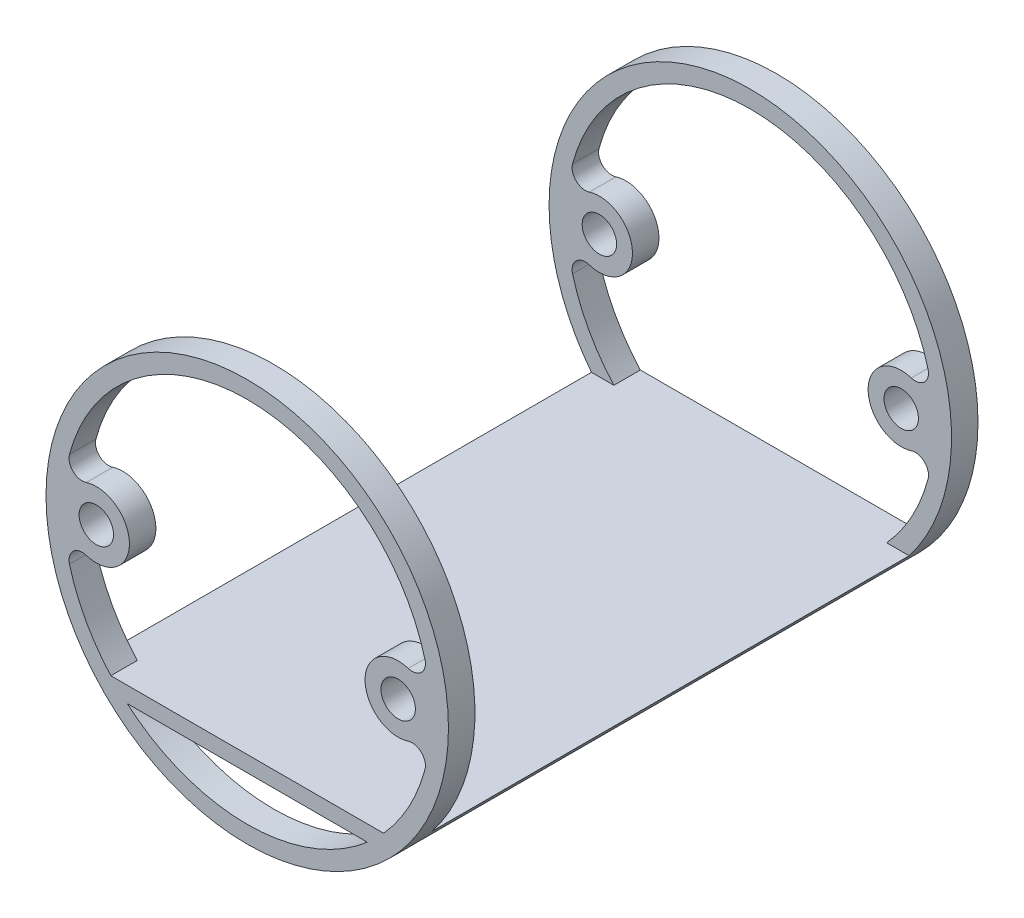
ISO-10303-21;
HEADER;
FILE_DESCRIPTION(('STEP AP214'),'2;1');
FILE_NAME('part.step','',(''),(''),'','','');
FILE_SCHEMA(('AUTOMOTIVE_DESIGN { 1 0 10303 214 1 1 1 1 }'));
ENDSEC;
DATA;
#1=APPLICATION_CONTEXT('core data for automotive mechanical design processes');
#2=APPLICATION_PROTOCOL_DEFINITION('international standard','automotive_design',2000,#1);
#3=PRODUCT_CONTEXT('',#1,'mechanical');
#4=PRODUCT('Part','Part','',(#3));
#5=PRODUCT_RELATED_PRODUCT_CATEGORY('part','',(#4));
#6=PRODUCT_DEFINITION_FORMATION('','',#4);
#7=PRODUCT_DEFINITION_CONTEXT('part definition',#1,'design');
#8=PRODUCT_DEFINITION('design','',#6,#7);
#9=PRODUCT_DEFINITION_SHAPE('','',#8);
#10=(LENGTH_UNIT() NAMED_UNIT(*) SI_UNIT(.MILLI.,.METRE.));
#11=(NAMED_UNIT(*) PLANE_ANGLE_UNIT() SI_UNIT($,.RADIAN.));
#12=(NAMED_UNIT(*) SI_UNIT($,.STERADIAN.) SOLID_ANGLE_UNIT());
#13=UNCERTAINTY_MEASURE_WITH_UNIT(LENGTH_MEASURE(1.E-05),#10,'distance_accuracy_value','');
#14=(GEOMETRIC_REPRESENTATION_CONTEXT(3) GLOBAL_UNCERTAINTY_ASSIGNED_CONTEXT((#13)) GLOBAL_UNIT_ASSIGNED_CONTEXT((#10,
#11,#12)) REPRESENTATION_CONTEXT('',''));
#15=CARTESIAN_POINT('',(0.,0.,0.));
#16=DIRECTION('',(0.,0.,1.));
#17=DIRECTION('',(1.,0.,0.));
#18=AXIS2_PLACEMENT_3D('',#15,#16,#17);
#19=CARTESIAN_POINT('',(0.,0.,0.));
#20=DIRECTION('',(0.,0.,1.));
#21=DIRECTION('',(1.,0.,0.));
#22=AXIS2_PLACEMENT_3D('',#19,#20,#21);
#23=PLANE('',#22);
#24=CARTESIAN_POINT('',(28.5,0.,0.));
#25=DIRECTION('',(0.,0.,1.));
#26=DIRECTION('',(1.,0.,0.));
#27=AXIS2_PLACEMENT_3D('',#24,#25,#26);
#28=CIRCLE('',#27,3.25);
#29=CARTESIAN_POINT('',(31.75,0.,0.));
#30=VERTEX_POINT('',#29);
#31=EDGE_CURVE('E519',#30,#30,#28,.T.);
#32=ORIENTED_EDGE('',*,*,#31,.T.);
#33=EDGE_LOOP('',(#32));
#34=FACE_BOUND('',#33,.T.);
#35=CARTESIAN_POINT('',(-28.5,0.,0.));
#36=DIRECTION('',(0.,0.,1.));
#37=DIRECTION('',(1.,0.,0.));
#38=AXIS2_PLACEMENT_3D('',#35,#36,#37);
#39=CIRCLE('',#38,3.25);
#40=CARTESIAN_POINT('',(-25.25,0.,0.));
#41=VERTEX_POINT('',#40);
#42=EDGE_CURVE('E524',#41,#41,#39,.T.);
#43=ORIENTED_EDGE('',*,*,#42,.T.);
#44=EDGE_LOOP('',(#43));
#45=FACE_BOUND('',#44,.T.);
#46=DIRECTION('',(1.,0.,0.));
#47=VECTOR('',#46,1.);
#48=CARTESIAN_POINT('',(30.,-23.3238075793812,0.));
#49=LINE('',#48,#47);
#50=CARTESIAN_POINT('',(-30.,-23.3238075793812,0.));
#51=VERTEX_POINT('',#50);
#52=CARTESIAN_POINT('',(-25.7597069082705,-23.3238075793812,0.));
#53=VERTEX_POINT('',#52);
#54=EDGE_CURVE('E55',#51,#53,#49,.T.);
#55=ORIENTED_EDGE('',*,*,#54,.F.);
#56=CARTESIAN_POINT('',(0.,0.,0.));
#57=DIRECTION('',(0.,0.,1.));
#58=DIRECTION('',(1.,0.,0.));
#59=AXIS2_PLACEMENT_3D('',#56,#57,#58);
#60=CIRCLE('',#59,38.);
#61=CARTESIAN_POINT('',(30.,-23.3238075793812,0.));
#62=VERTEX_POINT('',#61);
#63=EDGE_CURVE('E47',#62,#51,#60,.T.);
#64=ORIENTED_EDGE('',*,*,#63,.F.);
#65=CARTESIAN_POINT('',(25.7597069082705,-23.3238075793812,0.));
#66=VERTEX_POINT('',#65);
#67=EDGE_CURVE('E11',#66,#62,#49,.T.);
#68=ORIENTED_EDGE('',*,*,#67,.F.);
#69=CARTESIAN_POINT('',(0.,0.,0.));
#70=DIRECTION('',(0.,0.,1.));
#71=DIRECTION('',(1.,0.,0.));
#72=AXIS2_PLACEMENT_3D('',#69,#70,#71);
#73=CIRCLE('',#72,34.75);
#74=CARTESIAN_POINT('',(33.5685094519244,-8.98430148514971,0.));
#75=VERTEX_POINT('',#74);
#76=EDGE_CURVE('E457',#66,#75,#73,.T.);
#77=ORIENTED_EDGE('',*,*,#76,.T.);
#78=CARTESIAN_POINT('',(31.1535087719298,-8.33794886031878,0.));
#79=DIRECTION('',(0.,0.,1.));
#80=DIRECTION('',(1.,0.,0.));
#81=AXIS2_PLACEMENT_3D('',#78,#79,#80);
#82=CIRCLE('',#81,2.5);
#83=CARTESIAN_POINT('',(30.3953634085213,-5.95567775737055,0.));
#84=VERTEX_POINT('',#83);
#85=EDGE_CURVE('E461',#75,#84,#82,.T.);
#86=ORIENTED_EDGE('',*,*,#85,.T.);
#87=CARTESIAN_POINT('',(28.5,0.,0.));
#88=DIRECTION('',(0.,0.,-1.));
#89=DIRECTION('',(1.,0.,0.));
#90=AXIS2_PLACEMENT_3D('',#87,#88,#89);
#91=CIRCLE('',#90,6.25);
#92=CARTESIAN_POINT('',(30.3953634085213,5.95567775737058,0.));
#93=VERTEX_POINT('',#92);
#94=EDGE_CURVE('E465',#84,#93,#91,.T.);
#95=ORIENTED_EDGE('',*,*,#94,.T.);
#96=CARTESIAN_POINT('',(31.1535087719298,8.33794886031881,0.));
#97=DIRECTION('',(0.,0.,1.));
#98=DIRECTION('',(1.,0.,0.));
#99=AXIS2_PLACEMENT_3D('',#96,#97,#98);
#100=CIRCLE('',#99,2.5);
#101=CARTESIAN_POINT('',(33.5685094519244,8.98430148514972,0.));
#102=VERTEX_POINT('',#101);
#103=EDGE_CURVE('E469',#93,#102,#100,.T.);
#104=ORIENTED_EDGE('',*,*,#103,.T.);
#105=CARTESIAN_POINT('',(0.,0.,0.));
#106=DIRECTION('',(0.,0.,1.));
#107=DIRECTION('',(1.,0.,0.));
#108=AXIS2_PLACEMENT_3D('',#105,#106,#107);
#109=CIRCLE('',#108,34.75);
#110=CARTESIAN_POINT('',(-33.5685094519244,8.98430148514971,0.));
#111=VERTEX_POINT('',#110);
#112=EDGE_CURVE('E473',#102,#111,#109,.T.);
#113=ORIENTED_EDGE('',*,*,#112,.T.);
#114=CARTESIAN_POINT('',(-31.1535087719298,8.33794886031879,0.));
#115=DIRECTION('',(0.,0.,1.));
#116=DIRECTION('',(1.,0.,0.));
#117=AXIS2_PLACEMENT_3D('',#114,#115,#116);
#118=CIRCLE('',#117,2.5);
#119=CARTESIAN_POINT('',(-30.3953634085213,5.95567775737057,0.));
#120=VERTEX_POINT('',#119);
#121=EDGE_CURVE('E477',#111,#120,#118,.T.);
#122=ORIENTED_EDGE('',*,*,#121,.T.);
#123=CARTESIAN_POINT('',(-28.5,0.,0.));
#124=DIRECTION('',(0.,0.,-1.));
#125=DIRECTION('',(1.,0.,0.));
#126=AXIS2_PLACEMENT_3D('',#123,#124,#125);
#127=CIRCLE('',#126,6.25);
#128=CARTESIAN_POINT('',(-30.3953634085213,-5.95567775737057,0.));
#129=VERTEX_POINT('',#128);
#130=EDGE_CURVE('E481',#120,#129,#127,.T.);
#131=ORIENTED_EDGE('',*,*,#130,.T.);
#132=CARTESIAN_POINT('',(-31.1535087719298,-8.33794886031879,0.));
#133=DIRECTION('',(0.,0.,1.));
#134=DIRECTION('',(1.,0.,0.));
#135=AXIS2_PLACEMENT_3D('',#132,#133,#134);
#136=CIRCLE('',#135,2.5);
#137=CARTESIAN_POINT('',(-33.5685094519244,-8.98430148514971,0.));
#138=VERTEX_POINT('',#137);
#139=EDGE_CURVE('E425',#129,#138,#136,.T.);
#140=ORIENTED_EDGE('',*,*,#139,.T.);
#141=CARTESIAN_POINT('',(0.,0.,0.));
#142=DIRECTION('',(0.,0.,1.));
#143=DIRECTION('',(1.,0.,0.));
#144=AXIS2_PLACEMENT_3D('',#141,#142,#143);
#145=CIRCLE('',#144,34.75);
#146=EDGE_CURVE('E420',#138,#53,#145,.T.);
#147=ORIENTED_EDGE('',*,*,#146,.T.);
#148=EDGE_LOOP('',(#55,#64,#68,#77,#86,#95,#104,#113,#122,#131,#140,#147));
#149=FACE_BOUND('',#148,.T.);
#150=ADVANCED_FACE('F43',(#34,#45,#149),#23,.F.);
#151=DIRECTION('',(-1.,0.,0.));
#152=VECTOR('',#151,1.);
#153=CARTESIAN_POINT('',(-27.4054219913453,-26.3238075793812,0.));
#154=LINE('',#153,#152);
#155=CARTESIAN_POINT('',(27.4054219913453,-26.3238075793812,0.));
#156=VERTEX_POINT('',#155);
#157=CARTESIAN_POINT('',(22.6852298759284,-26.3238075793812,0.));
#158=VERTEX_POINT('',#157);
#159=EDGE_CURVE('E371',#156,#158,#154,.T.);
#160=ORIENTED_EDGE('',*,*,#159,.F.);
#161=CARTESIAN_POINT('',(-27.4054219913453,-26.3238075793812,0.));
#162=VERTEX_POINT('',#161);
#163=EDGE_CURVE('E537',#162,#156,#60,.T.);
#164=ORIENTED_EDGE('',*,*,#163,.F.);
#165=CARTESIAN_POINT('',(-22.6852298759284,-26.3238075793812,0.));
#166=VERTEX_POINT('',#165);
#167=EDGE_CURVE('E53',#166,#162,#154,.T.);
#168=ORIENTED_EDGE('',*,*,#167,.F.);
#169=CARTESIAN_POINT('',(0.,0.,0.));
#170=DIRECTION('',(0.,0.,1.));
#171=DIRECTION('',(1.,0.,0.));
#172=AXIS2_PLACEMENT_3D('',#169,#170,#171);
#173=CIRCLE('',#172,34.75);
#174=EDGE_CURVE('E403',#166,#158,#173,.T.);
#175=ORIENTED_EDGE('',*,*,#174,.T.);
#176=EDGE_LOOP('',(#160,#164,#168,#175));
#177=FACE_BOUND('',#176,.T.);
#178=ADVANCED_FACE('F569',(#177),#23,.F.);
#179=CARTESIAN_POINT('',(0.,0.,5.));
#180=DIRECTION('',(0.,0.,1.));
#181=DIRECTION('',(1.,0.,0.));
#182=AXIS2_PLACEMENT_3D('',#179,#180,#181);
#183=PLANE('',#182);
#184=CARTESIAN_POINT('',(-28.5,0.,5.));
#185=DIRECTION('',(0.,0.,1.));
#186=DIRECTION('',(1.,0.,0.));
#187=AXIS2_PLACEMENT_3D('',#184,#185,#186);
#188=CIRCLE('',#187,3.25);
#189=CARTESIAN_POINT('',(-25.25,0.,5.));
#190=VERTEX_POINT('',#189);
#191=EDGE_CURVE('E528',#190,#190,#188,.T.);
#192=ORIENTED_EDGE('',*,*,#191,.F.);
#193=EDGE_LOOP('',(#192));
#194=FACE_BOUND('',#193,.T.);
#195=CARTESIAN_POINT('',(0.,0.,5.));
#196=DIRECTION('',(0.,0.,1.));
#197=DIRECTION('',(1.,0.,0.));
#198=AXIS2_PLACEMENT_3D('',#195,#196,#197);
#199=CIRCLE('',#198,38.);
#200=CARTESIAN_POINT('',(38.,0.,5.));
#201=VERTEX_POINT('',#200);
#202=EDGE_CURVE('E534',#201,#201,#199,.T.);
#203=ORIENTED_EDGE('',*,*,#202,.T.);
#204=EDGE_LOOP('',(#203));
#205=FACE_BOUND('',#204,.T.);
#206=CARTESIAN_POINT('',(28.5,0.,5.));
#207=DIRECTION('',(0.,0.,1.));
#208=DIRECTION('',(1.,0.,0.));
#209=AXIS2_PLACEMENT_3D('',#206,#207,#208);
#210=CIRCLE('',#209,3.25);
#211=CARTESIAN_POINT('',(31.75,0.,5.));
#212=VERTEX_POINT('',#211);
#213=EDGE_CURVE('E520',#212,#212,#210,.T.);
#214=ORIENTED_EDGE('',*,*,#213,.F.);
#215=EDGE_LOOP('',(#214));
#216=FACE_BOUND('',#215,.T.);
#217=DIRECTION('',(1.,0.,0.));
#218=VECTOR('',#217,1.);
#219=CARTESIAN_POINT('',(-25.7597069082705,-23.3238075793812,5.));
#220=LINE('',#219,#218);
#221=CARTESIAN_POINT('',(-25.7597069082705,-23.3238075793812,5.));
#222=VERTEX_POINT('',#221);
#223=CARTESIAN_POINT('',(25.7597069082705,-23.3238075793812,5.));
#224=VERTEX_POINT('',#223);
#225=EDGE_CURVE('E424',#222,#224,#220,.T.);
#226=ORIENTED_EDGE('',*,*,#225,.F.);
#227=CARTESIAN_POINT('',(0.,0.,5.));
#228=DIRECTION('',(0.,0.,1.));
#229=DIRECTION('',(1.,0.,0.));
#230=AXIS2_PLACEMENT_3D('',#227,#228,#229);
#231=CIRCLE('',#230,34.75);
#232=CARTESIAN_POINT('',(-33.5685094519244,-8.98430148514971,5.));
#233=VERTEX_POINT('',#232);
#234=EDGE_CURVE('E421',#233,#222,#231,.T.);
#235=ORIENTED_EDGE('',*,*,#234,.F.);
#236=CARTESIAN_POINT('',(-31.1535087719298,-8.33794886031879,5.));
#237=DIRECTION('',(0.,0.,1.));
#238=DIRECTION('',(1.,0.,0.));
#239=AXIS2_PLACEMENT_3D('',#236,#237,#238);
#240=CIRCLE('',#239,2.5);
#241=CARTESIAN_POINT('',(-30.3953634085213,-5.95567775737057,5.));
#242=VERTEX_POINT('',#241);
#243=EDGE_CURVE('E450',#242,#233,#240,.T.);
#244=ORIENTED_EDGE('',*,*,#243,.F.);
#245=CARTESIAN_POINT('',(-28.5,0.,5.));
#246=DIRECTION('',(0.,0.,-1.));
#247=DIRECTION('',(1.,0.,0.));
#248=AXIS2_PLACEMENT_3D('',#245,#246,#247);
#249=CIRCLE('',#248,6.25);
#250=CARTESIAN_POINT('',(-30.3953634085213,5.95567775737057,5.));
#251=VERTEX_POINT('',#250);
#252=EDGE_CURVE('E446',#251,#242,#249,.T.);
#253=ORIENTED_EDGE('',*,*,#252,.F.);
#254=CARTESIAN_POINT('',(-31.1535087719298,8.33794886031879,5.));
#255=DIRECTION('',(0.,0.,1.));
#256=DIRECTION('',(1.,0.,0.));
#257=AXIS2_PLACEMENT_3D('',#254,#255,#256);
#258=CIRCLE('',#257,2.5);
#259=CARTESIAN_POINT('',(-33.5685094519244,8.98430148514971,5.));
#260=VERTEX_POINT('',#259);
#261=EDGE_CURVE('E443',#260,#251,#258,.T.);
#262=ORIENTED_EDGE('',*,*,#261,.F.);
#263=CARTESIAN_POINT('',(0.,0.,5.));
#264=DIRECTION('',(0.,0.,1.));
#265=DIRECTION('',(1.,0.,0.));
#266=AXIS2_PLACEMENT_3D('',#263,#264,#265);
#267=CIRCLE('',#266,34.75);
#268=CARTESIAN_POINT('',(33.5685094519244,8.98430148514972,5.));
#269=VERTEX_POINT('',#268);
#270=EDGE_CURVE('E440',#269,#260,#267,.T.);
#271=ORIENTED_EDGE('',*,*,#270,.F.);
#272=CARTESIAN_POINT('',(31.1535087719298,8.33794886031881,5.));
#273=DIRECTION('',(0.,0.,1.));
#274=DIRECTION('',(1.,0.,0.));
#275=AXIS2_PLACEMENT_3D('',#272,#273,#274);
#276=CIRCLE('',#275,2.5);
#277=CARTESIAN_POINT('',(30.3953634085213,5.95567775737058,5.));
#278=VERTEX_POINT('',#277);
#279=EDGE_CURVE('E437',#278,#269,#276,.T.);
#280=ORIENTED_EDGE('',*,*,#279,.F.);
#281=CARTESIAN_POINT('',(28.5,0.,5.));
#282=DIRECTION('',(0.,0.,-1.));
#283=DIRECTION('',(1.,0.,0.));
#284=AXIS2_PLACEMENT_3D('',#281,#282,#283);
#285=CIRCLE('',#284,6.25);
#286=CARTESIAN_POINT('',(30.3953634085213,-5.95567775737055,5.));
#287=VERTEX_POINT('',#286);
#288=EDGE_CURVE('E434',#287,#278,#285,.T.);
#289=ORIENTED_EDGE('',*,*,#288,.F.);
#290=CARTESIAN_POINT('',(31.1535087719298,-8.33794886031878,5.));
#291=DIRECTION('',(0.,0.,1.));
#292=DIRECTION('',(1.,0.,0.));
#293=AXIS2_PLACEMENT_3D('',#290,#291,#292);
#294=CIRCLE('',#293,2.5);
#295=CARTESIAN_POINT('',(33.5685094519244,-8.98430148514971,5.));
#296=VERTEX_POINT('',#295);
#297=EDGE_CURVE('E431',#296,#287,#294,.T.);
#298=ORIENTED_EDGE('',*,*,#297,.F.);
#299=CARTESIAN_POINT('',(0.,0.,5.));
#300=DIRECTION('',(0.,0.,1.));
#301=DIRECTION('',(1.,0.,0.));
#302=AXIS2_PLACEMENT_3D('',#299,#300,#301);
#303=CIRCLE('',#302,34.75);
#304=EDGE_CURVE('E428',#224,#296,#303,.T.);
#305=ORIENTED_EDGE('',*,*,#304,.F.);
#306=EDGE_LOOP('',(#226,#235,#244,#253,#262,#271,#280,#289,#298,#305));
#307=FACE_BOUND('',#306,.T.);
#308=DIRECTION('',(-1.,0.,0.));
#309=VECTOR('',#308,1.);
#310=CARTESIAN_POINT('',(-22.6852298759284,-26.3238075793812,5.));
#311=LINE('',#310,#309);
#312=CARTESIAN_POINT('',(22.6852298759284,-26.3238075793812,5.));
#313=VERTEX_POINT('',#312);
#314=CARTESIAN_POINT('',(-22.6852298759284,-26.3238075793812,5.));
#315=VERTEX_POINT('',#314);
#316=EDGE_CURVE('E408',#313,#315,#311,.T.);
#317=ORIENTED_EDGE('',*,*,#316,.F.);
#318=CARTESIAN_POINT('',(0.,0.,5.));
#319=DIRECTION('',(0.,0.,1.));
#320=DIRECTION('',(1.,0.,0.));
#321=AXIS2_PLACEMENT_3D('',#318,#319,#320);
#322=CIRCLE('',#321,34.75);
#323=EDGE_CURVE('E404',#315,#313,#322,.T.);
#324=ORIENTED_EDGE('',*,*,#323,.F.);
#325=EDGE_LOOP('',(#317,#324));
#326=FACE_BOUND('',#325,.T.);
#327=ADVANCED_FACE('F575',(#194,#205,#216,#307,#326),#183,.T.);
#328=CARTESIAN_POINT('',(0.,0.,5.));
#329=DIRECTION('',(0.,0.,-1.));
#330=DIRECTION('',(-1.,0.,0.));
#331=AXIS2_PLACEMENT_3D('',#328,#329,#330);
#332=CYLINDRICAL_SURFACE('',#331,38.);
#333=DIRECTION('',(0.,0.,1.));
#334=VECTOR('',#333,1.);
#335=CARTESIAN_POINT('',(27.4054219913453,-26.3238075793812,-90.));
#336=LINE('',#335,#334);
#337=CARTESIAN_POINT('',(27.4054219913453,-26.3238075793812,-90.));
#338=VERTEX_POINT('',#337);
#339=EDGE_CURVE('E399',#338,#156,#336,.T.);
#340=ORIENTED_EDGE('',*,*,#339,.F.);
#341=CARTESIAN_POINT('',(0.,0.,-90.));
#342=DIRECTION('',(0.,0.,-1.));
#343=DIRECTION('',(-1.,0.,0.));
#344=AXIS2_PLACEMENT_3D('',#341,#342,#343);
#345=CIRCLE('',#344,38.);
#346=CARTESIAN_POINT('',(-27.4054219913453,-26.3238075793812,-90.));
#347=VERTEX_POINT('',#346);
#348=EDGE_CURVE('E372',#338,#347,#345,.T.);
#349=ORIENTED_EDGE('',*,*,#348,.T.);
#350=DIRECTION('',(0.,0.,1.));
#351=VECTOR('',#350,1.);
#352=CARTESIAN_POINT('',(-27.4054219913453,-26.3238075793812,-90.));
#353=LINE('',#352,#351);
#354=EDGE_CURVE('E395',#347,#162,#353,.T.);
#355=ORIENTED_EDGE('',*,*,#354,.T.);
#356=ORIENTED_EDGE('',*,*,#163,.T.);
#357=EDGE_LOOP('',(#340,#349,#355,#356));
#358=FACE_BOUND('',#357,.T.);
#359=ORIENTED_EDGE('',*,*,#202,.F.);
#360=EDGE_LOOP('',(#359));
#361=FACE_BOUND('',#360,.T.);
#362=ORIENTED_EDGE('',*,*,#63,.T.);
#363=DIRECTION('',(0.,0.,1.));
#364=VECTOR('',#363,1.);
#365=CARTESIAN_POINT('',(-30.,-23.3238075793812,-90.));
#366=LINE('',#365,#364);
#367=CARTESIAN_POINT('',(-30.,-23.3238075793812,-90.));
#368=VERTEX_POINT('',#367);
#369=EDGE_CURVE('E391',#368,#51,#366,.T.);
#370=ORIENTED_EDGE('',*,*,#369,.F.);
#371=CARTESIAN_POINT('',(30.,-23.3238075793812,-90.));
#372=VERTEX_POINT('',#371);
#373=EDGE_CURVE('E366',#368,#372,#345,.T.);
#374=ORIENTED_EDGE('',*,*,#373,.T.);
#375=DIRECTION('',(0.,0.,1.));
#376=VECTOR('',#375,1.);
#377=CARTESIAN_POINT('',(30.,-23.3238075793812,-90.));
#378=LINE('',#377,#376);
#379=EDGE_CURVE('E382',#372,#62,#378,.T.);
#380=ORIENTED_EDGE('',*,*,#379,.T.);
#381=EDGE_LOOP('',(#362,#370,#374,#380));
#382=FACE_BOUND('',#381,.T.);
#383=CARTESIAN_POINT('',(0.,0.,-95.));
#384=DIRECTION('',(0.,0.,-1.));
#385=DIRECTION('',(-1.,0.,0.));
#386=AXIS2_PLACEMENT_3D('',#383,#384,#385);
#387=CIRCLE('',#386,38.);
#388=CARTESIAN_POINT('',(-38.,0.,-95.));
#389=VERTEX_POINT('',#388);
#390=EDGE_CURVE('E367',#389,#389,#387,.T.);
#391=ORIENTED_EDGE('',*,*,#390,.F.);
#392=EDGE_LOOP('',(#391));
#393=FACE_BOUND('',#392,.T.);
#394=ADVANCED_FACE('F45',(#358,#361,#382,#393),#332,.T.);
#395=CARTESIAN_POINT('',(-28.5,0.,5.));
#396=DIRECTION('',(0.,0.,-1.));
#397=DIRECTION('',(-1.,0.,0.));
#398=AXIS2_PLACEMENT_3D('',#395,#396,#397);
#399=CYLINDRICAL_SURFACE('',#398,3.25);
#400=ORIENTED_EDGE('',*,*,#191,.T.);
#401=EDGE_LOOP('',(#400));
#402=FACE_BOUND('',#401,.T.);
#403=ORIENTED_EDGE('',*,*,#42,.F.);
#404=EDGE_LOOP('',(#403));
#405=FACE_BOUND('',#404,.T.);
#406=ADVANCED_FACE('F583',(#402,#405),#399,.F.);
#407=CARTESIAN_POINT('',(28.5,0.,5.));
#408=DIRECTION('',(0.,0.,-1.));
#409=DIRECTION('',(-1.,0.,0.));
#410=AXIS2_PLACEMENT_3D('',#407,#408,#409);
#411=CYLINDRICAL_SURFACE('',#410,3.25);
#412=ORIENTED_EDGE('',*,*,#213,.T.);
#413=EDGE_LOOP('',(#412));
#414=FACE_BOUND('',#413,.T.);
#415=ORIENTED_EDGE('',*,*,#31,.F.);
#416=EDGE_LOOP('',(#415));
#417=FACE_BOUND('',#416,.T.);
#418=ADVANCED_FACE('F662',(#414,#417),#411,.F.);
#419=CARTESIAN_POINT('',(0.,0.,5.));
#420=DIRECTION('',(0.,0.,-1.));
#421=DIRECTION('',(-1.,0.,0.));
#422=AXIS2_PLACEMENT_3D('',#419,#420,#421);
#423=CYLINDRICAL_SURFACE('',#422,34.75);
#424=ORIENTED_EDGE('',*,*,#146,.F.);
#425=DIRECTION('',(0.,0.,-1.));
#426=VECTOR('',#425,1.);
#427=CARTESIAN_POINT('',(-33.5685094519244,-8.98430148514971,5.));
#428=LINE('',#427,#426);
#429=EDGE_CURVE('E453',#233,#138,#428,.T.);
#430=ORIENTED_EDGE('',*,*,#429,.F.);
#431=ORIENTED_EDGE('',*,*,#234,.T.);
#432=DIRECTION('',(0.,0.,-1.));
#433=VECTOR('',#432,1.);
#434=CARTESIAN_POINT('',(-25.7597069082705,-23.3238075793812,5.));
#435=LINE('',#434,#433);
#436=EDGE_CURVE('E516',#222,#53,#435,.T.);
#437=ORIENTED_EDGE('',*,*,#436,.T.);
#438=EDGE_LOOP('',(#424,#430,#431,#437));
#439=FACE_BOUND('',#438,.T.);
#440=ADVANCED_FACE('F596',(#439),#423,.F.);
#441=CARTESIAN_POINT('',(-25.7597069082705,-23.3238075793812,5.));
#442=DIRECTION('',(0.,1.,0.));
#443=DIRECTION('',(0.,0.,1.));
#444=AXIS2_PLACEMENT_3D('',#441,#442,#443);
#445=PLANE('',#444);
#446=DIRECTION('',(0.,0.,-1.));
#447=VECTOR('',#446,1.);
#448=CARTESIAN_POINT('',(25.7597069082705,-23.3238075793812,5.));
#449=LINE('',#448,#447);
#450=EDGE_CURVE('E512',#224,#66,#449,.T.);
#451=ORIENTED_EDGE('',*,*,#450,.T.);
#452=ORIENTED_EDGE('',*,*,#67,.T.);
#453=ORIENTED_EDGE('',*,*,#379,.F.);
#454=DIRECTION('',(1.,0.,0.));
#455=VECTOR('',#454,1.);
#456=CARTESIAN_POINT('',(30.,-23.3238075793812,-90.));
#457=LINE('',#456,#455);
#458=CARTESIAN_POINT('',(25.7597069082705,-23.3238075793812,-90.));
#459=VERTEX_POINT('',#458);
#460=EDGE_CURVE('E62',#459,#372,#457,.T.);
#461=ORIENTED_EDGE('',*,*,#460,.F.);
#462=DIRECTION('',(0.,0.,1.));
#463=VECTOR('',#462,1.);
#464=CARTESIAN_POINT('',(25.7597069082705,-23.3238075793812,-95.));
#465=LINE('',#464,#463);
#466=CARTESIAN_POINT('',(25.7597069082705,-23.3238075793812,-95.));
#467=VERTEX_POINT('',#466);
#468=EDGE_CURVE('E359',#467,#459,#465,.T.);
#469=ORIENTED_EDGE('',*,*,#468,.F.);
#470=DIRECTION('',(-1.,0.,0.));
#471=VECTOR('',#470,1.);
#472=CARTESIAN_POINT('',(-25.7597069082705,-23.3238075793812,-95.));
#473=LINE('',#472,#471);
#474=CARTESIAN_POINT('',(-25.7597069082705,-23.3238075793812,-95.));
#475=VERTEX_POINT('',#474);
#476=EDGE_CURVE('E276',#467,#475,#473,.T.);
#477=ORIENTED_EDGE('',*,*,#476,.T.);
#478=DIRECTION('',(0.,0.,1.));
#479=VECTOR('',#478,1.);
#480=CARTESIAN_POINT('',(-25.7597069082705,-23.3238075793812,-95.));
#481=LINE('',#480,#479);
#482=CARTESIAN_POINT('',(-25.7597069082705,-23.3238075793812,-90.));
#483=VERTEX_POINT('',#482);
#484=EDGE_CURVE('E356',#475,#483,#481,.T.);
#485=ORIENTED_EDGE('',*,*,#484,.T.);
#486=EDGE_CURVE('E70',#368,#483,#457,.T.);
#487=ORIENTED_EDGE('',*,*,#486,.F.);
#488=ORIENTED_EDGE('',*,*,#369,.T.);
#489=ORIENTED_EDGE('',*,*,#54,.T.);
#490=ORIENTED_EDGE('',*,*,#436,.F.);
#491=ORIENTED_EDGE('',*,*,#225,.T.);
#492=EDGE_LOOP('',(#451,#452,#453,#461,#469,#477,#485,#487,#488,#489,#490,#491));
#493=FACE_BOUND('',#492,.T.);
#494=ADVANCED_FACE('F551',(#493),#445,.T.);
#495=CARTESIAN_POINT('',(0.,0.,5.));
#496=DIRECTION('',(0.,0.,-1.));
#497=DIRECTION('',(-1.,0.,0.));
#498=AXIS2_PLACEMENT_3D('',#495,#496,#497);
#499=CYLINDRICAL_SURFACE('',#498,34.75);
#500=ORIENTED_EDGE('',*,*,#76,.F.);
#501=ORIENTED_EDGE('',*,*,#450,.F.);
#502=ORIENTED_EDGE('',*,*,#304,.T.);
#503=DIRECTION('',(0.,0.,-1.));
#504=VECTOR('',#503,1.);
#505=CARTESIAN_POINT('',(33.5685094519244,-8.98430148514971,5.));
#506=LINE('',#505,#504);
#507=EDGE_CURVE('E509',#296,#75,#506,.T.);
#508=ORIENTED_EDGE('',*,*,#507,.T.);
#509=EDGE_LOOP('',(#500,#501,#502,#508));
#510=FACE_BOUND('',#509,.T.);
#511=ADVANCED_FACE('F609',(#510),#499,.F.);
#512=CARTESIAN_POINT('',(31.1535087719298,-8.33794886031878,5.));
#513=DIRECTION('',(0.,0.,-1.));
#514=DIRECTION('',(-1.,0.,0.));
#515=AXIS2_PLACEMENT_3D('',#512,#513,#514);
#516=CYLINDRICAL_SURFACE('',#515,2.5);
#517=ORIENTED_EDGE('',*,*,#85,.F.);
#518=ORIENTED_EDGE('',*,*,#507,.F.);
#519=ORIENTED_EDGE('',*,*,#297,.T.);
#520=DIRECTION('',(0.,0.,-1.));
#521=VECTOR('',#520,1.);
#522=CARTESIAN_POINT('',(30.3953634085213,-5.95567775737055,5.));
#523=LINE('',#522,#521);
#524=EDGE_CURVE('E506',#287,#84,#523,.T.);
#525=ORIENTED_EDGE('',*,*,#524,.T.);
#526=EDGE_LOOP('',(#517,#518,#519,#525));
#527=FACE_BOUND('',#526,.T.);
#528=ADVANCED_FACE('F617',(#527),#516,.F.);
#529=CARTESIAN_POINT('',(28.5,0.,5.));
#530=DIRECTION('',(0.,0.,-1.));
#531=DIRECTION('',(-1.,0.,0.));
#532=AXIS2_PLACEMENT_3D('',#529,#530,#531);
#533=CYLINDRICAL_SURFACE('',#532,6.25);
#534=ORIENTED_EDGE('',*,*,#94,.F.);
#535=ORIENTED_EDGE('',*,*,#524,.F.);
#536=ORIENTED_EDGE('',*,*,#288,.T.);
#537=DIRECTION('',(0.,0.,-1.));
#538=VECTOR('',#537,1.);
#539=CARTESIAN_POINT('',(30.3953634085213,5.95567775737058,5.));
#540=LINE('',#539,#538);
#541=EDGE_CURVE('E503',#278,#93,#540,.T.);
#542=ORIENTED_EDGE('',*,*,#541,.T.);
#543=EDGE_LOOP('',(#534,#535,#536,#542));
#544=FACE_BOUND('',#543,.T.);
#545=ADVANCED_FACE('F620',(#544),#533,.T.);
#546=CARTESIAN_POINT('',(31.1535087719298,8.33794886031881,5.));
#547=DIRECTION('',(0.,0.,-1.));
#548=DIRECTION('',(-1.,0.,0.));
#549=AXIS2_PLACEMENT_3D('',#546,#547,#548);
#550=CYLINDRICAL_SURFACE('',#549,2.5);
#551=ORIENTED_EDGE('',*,*,#103,.F.);
#552=ORIENTED_EDGE('',*,*,#541,.F.);
#553=ORIENTED_EDGE('',*,*,#279,.T.);
#554=DIRECTION('',(0.,0.,-1.));
#555=VECTOR('',#554,1.);
#556=CARTESIAN_POINT('',(33.5685094519244,8.98430148514972,5.));
#557=LINE('',#556,#555);
#558=EDGE_CURVE('E500',#269,#102,#557,.T.);
#559=ORIENTED_EDGE('',*,*,#558,.T.);
#560=EDGE_LOOP('',(#551,#552,#553,#559));
#561=FACE_BOUND('',#560,.T.);
#562=ADVANCED_FACE('F625',(#561),#550,.F.);
#563=CARTESIAN_POINT('',(0.,0.,5.));
#564=DIRECTION('',(0.,0.,-1.));
#565=DIRECTION('',(-1.,0.,0.));
#566=AXIS2_PLACEMENT_3D('',#563,#564,#565);
#567=CYLINDRICAL_SURFACE('',#566,34.75);
#568=ORIENTED_EDGE('',*,*,#112,.F.);
#569=ORIENTED_EDGE('',*,*,#558,.F.);
#570=ORIENTED_EDGE('',*,*,#270,.T.);
#571=DIRECTION('',(0.,0.,-1.));
#572=VECTOR('',#571,1.);
#573=CARTESIAN_POINT('',(-33.5685094519244,8.98430148514971,5.));
#574=LINE('',#573,#572);
#575=EDGE_CURVE('E497',#260,#111,#574,.T.);
#576=ORIENTED_EDGE('',*,*,#575,.T.);
#577=EDGE_LOOP('',(#568,#569,#570,#576));
#578=FACE_BOUND('',#577,.T.);
#579=ADVANCED_FACE('F629',(#578),#567,.F.);
#580=CARTESIAN_POINT('',(-31.1535087719298,8.33794886031879,5.));
#581=DIRECTION('',(0.,0.,-1.));
#582=DIRECTION('',(-1.,0.,0.));
#583=AXIS2_PLACEMENT_3D('',#580,#581,#582);
#584=CYLINDRICAL_SURFACE('',#583,2.5);
#585=ORIENTED_EDGE('',*,*,#121,.F.);
#586=ORIENTED_EDGE('',*,*,#575,.F.);
#587=ORIENTED_EDGE('',*,*,#261,.T.);
#588=DIRECTION('',(0.,0.,-1.));
#589=VECTOR('',#588,1.);
#590=CARTESIAN_POINT('',(-30.3953634085213,5.95567775737057,5.));
#591=LINE('',#590,#589);
#592=EDGE_CURVE('E494',#251,#120,#591,.T.);
#593=ORIENTED_EDGE('',*,*,#592,.T.);
#594=EDGE_LOOP('',(#585,#586,#587,#593));
#595=FACE_BOUND('',#594,.T.);
#596=ADVANCED_FACE('F633',(#595),#584,.F.);
#597=CARTESIAN_POINT('',(-28.5,0.,5.));
#598=DIRECTION('',(0.,0.,-1.));
#599=DIRECTION('',(-1.,0.,0.));
#600=AXIS2_PLACEMENT_3D('',#597,#598,#599);
#601=CYLINDRICAL_SURFACE('',#600,6.25);
#602=ORIENTED_EDGE('',*,*,#130,.F.);
#603=ORIENTED_EDGE('',*,*,#592,.F.);
#604=ORIENTED_EDGE('',*,*,#252,.T.);
#605=DIRECTION('',(0.,0.,-1.));
#606=VECTOR('',#605,1.);
#607=CARTESIAN_POINT('',(-30.3953634085213,-5.95567775737057,5.));
#608=LINE('',#607,#606);
#609=EDGE_CURVE('E491',#242,#129,#608,.T.);
#610=ORIENTED_EDGE('',*,*,#609,.T.);
#611=EDGE_LOOP('',(#602,#603,#604,#610));
#612=FACE_BOUND('',#611,.T.);
#613=ADVANCED_FACE('F637',(#612),#601,.T.);
#614=CARTESIAN_POINT('',(-31.1535087719298,-8.33794886031879,5.));
#615=DIRECTION('',(0.,0.,-1.));
#616=DIRECTION('',(-1.,0.,0.));
#617=AXIS2_PLACEMENT_3D('',#614,#615,#616);
#618=CYLINDRICAL_SURFACE('',#617,2.5);
#619=ORIENTED_EDGE('',*,*,#139,.F.);
#620=ORIENTED_EDGE('',*,*,#609,.F.);
#621=ORIENTED_EDGE('',*,*,#243,.T.);
#622=ORIENTED_EDGE('',*,*,#429,.T.);
#623=EDGE_LOOP('',(#619,#620,#621,#622));
#624=FACE_BOUND('',#623,.T.);
#625=ADVANCED_FACE('F599',(#624),#618,.F.);
#626=CARTESIAN_POINT('',(0.,0.,5.));
#627=DIRECTION('',(0.,0.,-1.));
#628=DIRECTION('',(-1.,0.,0.));
#629=AXIS2_PLACEMENT_3D('',#626,#627,#628);
#630=CYLINDRICAL_SURFACE('',#629,34.75);
#631=ORIENTED_EDGE('',*,*,#174,.F.);
#632=DIRECTION('',(0.,0.,-1.));
#633=VECTOR('',#632,1.);
#634=CARTESIAN_POINT('',(-22.6852298759284,-26.3238075793812,5.));
#635=LINE('',#634,#633);
#636=EDGE_CURVE('E411',#315,#166,#635,.T.);
#637=ORIENTED_EDGE('',*,*,#636,.F.);
#638=ORIENTED_EDGE('',*,*,#323,.T.);
#639=DIRECTION('',(0.,0.,-1.));
#640=VECTOR('',#639,1.);
#641=CARTESIAN_POINT('',(22.6852298759284,-26.3238075793812,5.));
#642=LINE('',#641,#640);
#643=EDGE_CURVE('E417',#313,#158,#642,.T.);
#644=ORIENTED_EDGE('',*,*,#643,.T.);
#645=EDGE_LOOP('',(#631,#637,#638,#644));
#646=FACE_BOUND('',#645,.T.);
#647=ADVANCED_FACE('F571',(#646),#630,.F.);
#648=CARTESIAN_POINT('',(-22.6852298759284,-26.3238075793812,5.));
#649=DIRECTION('',(0.,-1.,0.));
#650=DIRECTION('',(0.,0.,-1.));
#651=AXIS2_PLACEMENT_3D('',#648,#649,#650);
#652=PLANE('',#651);
#653=ORIENTED_EDGE('',*,*,#636,.T.);
#654=ORIENTED_EDGE('',*,*,#167,.T.);
#655=ORIENTED_EDGE('',*,*,#354,.F.);
#656=DIRECTION('',(-1.,0.,0.));
#657=VECTOR('',#656,1.);
#658=CARTESIAN_POINT('',(-27.4054219913453,-26.3238075793812,-90.));
#659=LINE('',#658,#657);
#660=CARTESIAN_POINT('',(-22.6852298759284,-26.3238075793812,-90.));
#661=VERTEX_POINT('',#660);
#662=EDGE_CURVE('E379',#661,#347,#659,.T.);
#663=ORIENTED_EDGE('',*,*,#662,.F.);
#664=DIRECTION('',(0.,0.,1.));
#665=VECTOR('',#664,1.);
#666=CARTESIAN_POINT('',(-22.6852298759284,-26.3238075793812,-95.));
#667=LINE('',#666,#665);
#668=CARTESIAN_POINT('',(-22.6852298759284,-26.3238075793812,-95.));
#669=VERTEX_POINT('',#668);
#670=EDGE_CURVE('E241',#669,#661,#667,.T.);
#671=ORIENTED_EDGE('',*,*,#670,.F.);
#672=DIRECTION('',(1.,0.,0.));
#673=VECTOR('',#672,1.);
#674=CARTESIAN_POINT('',(22.6852298759284,-26.3238075793812,-95.));
#675=LINE('',#674,#673);
#676=CARTESIAN_POINT('',(22.6852298759284,-26.3238075793812,-95.));
#677=VERTEX_POINT('',#676);
#678=EDGE_CURVE('E235',#669,#677,#675,.T.);
#679=ORIENTED_EDGE('',*,*,#678,.T.);
#680=DIRECTION('',(0.,0.,1.));
#681=VECTOR('',#680,1.);
#682=CARTESIAN_POINT('',(22.6852298759284,-26.3238075793812,-95.));
#683=LINE('',#682,#681);
#684=CARTESIAN_POINT('',(22.6852298759284,-26.3238075793812,-90.));
#685=VERTEX_POINT('',#684);
#686=EDGE_CURVE('E239',#677,#685,#683,.T.);
#687=ORIENTED_EDGE('',*,*,#686,.T.);
#688=EDGE_CURVE('E376',#338,#685,#659,.T.);
#689=ORIENTED_EDGE('',*,*,#688,.F.);
#690=ORIENTED_EDGE('',*,*,#339,.T.);
#691=ORIENTED_EDGE('',*,*,#159,.T.);
#692=ORIENTED_EDGE('',*,*,#643,.F.);
#693=ORIENTED_EDGE('',*,*,#316,.T.);
#694=EDGE_LOOP('',(#653,#654,#655,#663,#671,#679,#687,#689,#690,#691,#692,#693));
#695=FACE_BOUND('',#694,.T.);
#696=ADVANCED_FACE('F238',(#695),#652,.T.);
#697=CARTESIAN_POINT('',(0.,0.,-90.));
#698=DIRECTION('',(0.,0.,-1.));
#699=DIRECTION('',(-1.,0.,0.));
#700=AXIS2_PLACEMENT_3D('',#697,#698,#699);
#701=PLANE('',#700);
#702=ORIENTED_EDGE('',*,*,#348,.F.);
#703=ORIENTED_EDGE('',*,*,#688,.T.);
#704=CARTESIAN_POINT('',(0.,0.,-90.));
#705=DIRECTION('',(0.,0.,-1.));
#706=DIRECTION('',(-1.,0.,0.));
#707=AXIS2_PLACEMENT_3D('',#704,#705,#706);
#708=CIRCLE('',#707,34.75);
#709=EDGE_CURVE('E252',#685,#661,#708,.T.);
#710=ORIENTED_EDGE('',*,*,#709,.T.);
#711=ORIENTED_EDGE('',*,*,#662,.T.);
#712=EDGE_LOOP('',(#702,#703,#710,#711));
#713=FACE_BOUND('',#712,.T.);
#714=ADVANCED_FACE('F565',(#713),#701,.F.);
#715=CARTESIAN_POINT('',(0.,0.,-95.));
#716=DIRECTION('',(0.,0.,-1.));
#717=DIRECTION('',(-1.,0.,0.));
#718=AXIS2_PLACEMENT_3D('',#715,#716,#717);
#719=PLANE('',#718);
#720=CARTESIAN_POINT('',(-28.5,0.,-95.));
#721=DIRECTION('',(0.,0.,-1.));
#722=DIRECTION('',(-1.,0.,0.));
#723=AXIS2_PLACEMENT_3D('',#720,#721,#722);
#724=CIRCLE('',#723,3.25);
#725=CARTESIAN_POINT('',(-31.75,0.,-95.));
#726=VERTEX_POINT('',#725);
#727=EDGE_CURVE('E260',#726,#726,#724,.T.);
#728=ORIENTED_EDGE('',*,*,#727,.F.);
#729=EDGE_LOOP('',(#728));
#730=FACE_BOUND('',#729,.T.);
#731=ORIENTED_EDGE('',*,*,#390,.T.);
#732=EDGE_LOOP('',(#731));
#733=FACE_BOUND('',#732,.T.);
#734=CARTESIAN_POINT('',(0.,0.,-95.));
#735=DIRECTION('',(0.,0.,-1.));
#736=DIRECTION('',(-1.,0.,0.));
#737=AXIS2_PLACEMENT_3D('',#734,#735,#736);
#738=CIRCLE('',#737,34.75);
#739=CARTESIAN_POINT('',(33.5685094519244,-8.9843014851497,-95.));
#740=VERTEX_POINT('',#739);
#741=EDGE_CURVE('E272',#740,#467,#738,.T.);
#742=ORIENTED_EDGE('',*,*,#741,.F.);
#743=CARTESIAN_POINT('',(31.1535087719298,-8.33794886031878,-95.));
#744=DIRECTION('',(0.,0.,-1.));
#745=DIRECTION('',(-1.,0.,0.));
#746=AXIS2_PLACEMENT_3D('',#743,#744,#745);
#747=CIRCLE('',#746,2.50000000000001);
#748=CARTESIAN_POINT('',(30.3953634085213,-5.95567775737055,-95.));
#749=VERTEX_POINT('',#748);
#750=EDGE_CURVE('E269',#749,#740,#747,.T.);
#751=ORIENTED_EDGE('',*,*,#750,.F.);
#752=CARTESIAN_POINT('',(28.5,0.,-95.));
#753=DIRECTION('',(0.,0.,1.));
#754=DIRECTION('',(-1.,0.,0.));
#755=AXIS2_PLACEMENT_3D('',#752,#753,#754);
#756=CIRCLE('',#755,6.25);
#757=CARTESIAN_POINT('',(30.3953634085213,5.95567775737057,-95.));
#758=VERTEX_POINT('',#757);
#759=EDGE_CURVE('E298',#758,#749,#756,.T.);
#760=ORIENTED_EDGE('',*,*,#759,.F.);
#761=CARTESIAN_POINT('',(31.1535087719298,8.33794886031881,-95.));
#762=DIRECTION('',(0.,0.,-1.));
#763=DIRECTION('',(-1.,0.,0.));
#764=AXIS2_PLACEMENT_3D('',#761,#762,#763);
#765=CIRCLE('',#764,2.5);
#766=CARTESIAN_POINT('',(33.5685094519244,8.98430148514972,-95.));
#767=VERTEX_POINT('',#766);
#768=EDGE_CURVE('E294',#767,#758,#765,.T.);
#769=ORIENTED_EDGE('',*,*,#768,.F.);
#770=CARTESIAN_POINT('',(0.,0.,-95.));
#771=DIRECTION('',(0.,0.,-1.));
#772=DIRECTION('',(-1.,0.,0.));
#773=AXIS2_PLACEMENT_3D('',#770,#771,#772);
#774=CIRCLE('',#773,34.75);
#775=CARTESIAN_POINT('',(-33.5685094519244,8.98430148514971,-95.));
#776=VERTEX_POINT('',#775);
#777=EDGE_CURVE('E291',#776,#767,#774,.T.);
#778=ORIENTED_EDGE('',*,*,#777,.F.);
#779=CARTESIAN_POINT('',(-31.1535087719298,8.33794886031879,-95.));
#780=DIRECTION('',(0.,0.,-1.));
#781=DIRECTION('',(-1.,0.,0.));
#782=AXIS2_PLACEMENT_3D('',#779,#780,#781);
#783=CIRCLE('',#782,2.5);
#784=CARTESIAN_POINT('',(-30.3953634085213,5.95567775737057,-95.));
#785=VERTEX_POINT('',#784);
#786=EDGE_CURVE('E288',#785,#776,#783,.T.);
#787=ORIENTED_EDGE('',*,*,#786,.F.);
#788=CARTESIAN_POINT('',(-28.5,0.,-95.));
#789=DIRECTION('',(0.,0.,1.));
#790=DIRECTION('',(-1.,0.,0.));
#791=AXIS2_PLACEMENT_3D('',#788,#789,#790);
#792=CIRCLE('',#791,6.25);
#793=CARTESIAN_POINT('',(-30.3953634085213,-5.95567775737057,-95.));
#794=VERTEX_POINT('',#793);
#795=EDGE_CURVE('E285',#794,#785,#792,.T.);
#796=ORIENTED_EDGE('',*,*,#795,.F.);
#797=CARTESIAN_POINT('',(-31.1535087719298,-8.33794886031879,-95.));
#798=DIRECTION('',(0.,0.,-1.));
#799=DIRECTION('',(-1.,0.,0.));
#800=AXIS2_PLACEMENT_3D('',#797,#798,#799);
#801=CIRCLE('',#800,2.5);
#802=CARTESIAN_POINT('',(-33.5685094519244,-8.98430148514971,-95.));
#803=VERTEX_POINT('',#802);
#804=EDGE_CURVE('E282',#803,#794,#801,.T.);
#805=ORIENTED_EDGE('',*,*,#804,.F.);
#806=CARTESIAN_POINT('',(0.,0.,-95.));
#807=DIRECTION('',(0.,0.,-1.));
#808=DIRECTION('',(-1.,0.,0.));
#809=AXIS2_PLACEMENT_3D('',#806,#807,#808);
#810=CIRCLE('',#809,34.75);
#811=EDGE_CURVE('E279',#475,#803,#810,.T.);
#812=ORIENTED_EDGE('',*,*,#811,.F.);
#813=ORIENTED_EDGE('',*,*,#476,.F.);
#814=EDGE_LOOP('',(#742,#751,#760,#769,#778,#787,#796,#805,#812,#813));
#815=FACE_BOUND('',#814,.T.);
#816=ORIENTED_EDGE('',*,*,#678,.F.);
#817=CARTESIAN_POINT('',(0.,0.,-95.));
#818=DIRECTION('',(0.,0.,-1.));
#819=DIRECTION('',(-1.,0.,0.));
#820=AXIS2_PLACEMENT_3D('',#817,#818,#819);
#821=CIRCLE('',#820,34.75);
#822=EDGE_CURVE('E246',#677,#669,#821,.T.);
#823=ORIENTED_EDGE('',*,*,#822,.F.);
#824=EDGE_LOOP('',(#816,#823));
#825=FACE_BOUND('',#824,.T.);
#826=CARTESIAN_POINT('',(28.5,0.,-95.));
#827=DIRECTION('',(0.,0.,-1.));
#828=DIRECTION('',(-1.,0.,0.));
#829=AXIS2_PLACEMENT_3D('',#826,#827,#828);
#830=CIRCLE('',#829,3.25);
#831=CARTESIAN_POINT('',(25.25,0.,-95.));
#832=VERTEX_POINT('',#831);
#833=EDGE_CURVE('E1014',#832,#832,#830,.T.);
#834=ORIENTED_EDGE('',*,*,#833,.F.);
#835=EDGE_LOOP('',(#834));
#836=FACE_BOUND('',#835,.T.);
#837=ADVANCED_FACE('F255',(#730,#733,#815,#825,#836),#719,.T.);
#838=ORIENTED_EDGE('',*,*,#373,.F.);
#839=ORIENTED_EDGE('',*,*,#486,.T.);
#840=CARTESIAN_POINT('',(0.,0.,-90.));
#841=DIRECTION('',(0.,0.,-1.));
#842=DIRECTION('',(-1.,0.,0.));
#843=AXIS2_PLACEMENT_3D('',#840,#841,#842);
#844=CIRCLE('',#843,34.75);
#845=CARTESIAN_POINT('',(-33.5685094519244,-8.98430148514971,-90.));
#846=VERTEX_POINT('',#845);
#847=EDGE_CURVE('E309',#483,#846,#844,.T.);
#848=ORIENTED_EDGE('',*,*,#847,.T.);
#849=CARTESIAN_POINT('',(-31.1535087719298,-8.33794886031879,-90.));
#850=DIRECTION('',(0.,0.,-1.));
#851=DIRECTION('',(-1.,0.,0.));
#852=AXIS2_PLACEMENT_3D('',#849,#850,#851);
#853=CIRCLE('',#852,2.5);
#854=CARTESIAN_POINT('',(-30.3953634085213,-5.95567775737057,-90.));
#855=VERTEX_POINT('',#854);
#856=EDGE_CURVE('E312',#846,#855,#853,.T.);
#857=ORIENTED_EDGE('',*,*,#856,.T.);
#858=CARTESIAN_POINT('',(-28.5,0.,-90.));
#859=DIRECTION('',(0.,0.,1.));
#860=DIRECTION('',(-1.,0.,0.));
#861=AXIS2_PLACEMENT_3D('',#858,#859,#860);
#862=CIRCLE('',#861,6.25);
#863=CARTESIAN_POINT('',(-30.3953634085213,5.95567775737057,-90.));
#864=VERTEX_POINT('',#863);
#865=EDGE_CURVE('E316',#855,#864,#862,.T.);
#866=ORIENTED_EDGE('',*,*,#865,.T.);
#867=CARTESIAN_POINT('',(-31.1535087719298,8.33794886031879,-90.));
#868=DIRECTION('',(0.,0.,-1.));
#869=DIRECTION('',(-1.,0.,0.));
#870=AXIS2_PLACEMENT_3D('',#867,#868,#869);
#871=CIRCLE('',#870,2.5);
#872=CARTESIAN_POINT('',(-33.5685094519244,8.98430148514971,-90.));
#873=VERTEX_POINT('',#872);
#874=EDGE_CURVE('E320',#864,#873,#871,.T.);
#875=ORIENTED_EDGE('',*,*,#874,.T.);
#876=CARTESIAN_POINT('',(0.,0.,-90.));
#877=DIRECTION('',(0.,0.,-1.));
#878=DIRECTION('',(-1.,0.,0.));
#879=AXIS2_PLACEMENT_3D('',#876,#877,#878);
#880=CIRCLE('',#879,34.75);
#881=CARTESIAN_POINT('',(33.5685094519244,8.98430148514972,-90.));
#882=VERTEX_POINT('',#881);
#883=EDGE_CURVE('E324',#873,#882,#880,.T.);
#884=ORIENTED_EDGE('',*,*,#883,.T.);
#885=CARTESIAN_POINT('',(31.1535087719298,8.33794886031881,-90.));
#886=DIRECTION('',(0.,0.,-1.));
#887=DIRECTION('',(-1.,0.,0.));
#888=AXIS2_PLACEMENT_3D('',#885,#886,#887);
#889=CIRCLE('',#888,2.5);
#890=CARTESIAN_POINT('',(30.3953634085213,5.95567775737058,-90.));
#891=VERTEX_POINT('',#890);
#892=EDGE_CURVE('E328',#882,#891,#889,.T.);
#893=ORIENTED_EDGE('',*,*,#892,.T.);
#894=CARTESIAN_POINT('',(28.5,0.,-90.));
#895=DIRECTION('',(0.,0.,1.));
#896=DIRECTION('',(-1.,0.,0.));
#897=AXIS2_PLACEMENT_3D('',#894,#895,#896);
#898=CIRCLE('',#897,6.25);
#899=CARTESIAN_POINT('',(30.3953634085213,-5.95567775737055,-90.));
#900=VERTEX_POINT('',#899);
#901=EDGE_CURVE('E273',#891,#900,#898,.T.);
#902=ORIENTED_EDGE('',*,*,#901,.T.);
#903=CARTESIAN_POINT('',(31.1535087719298,-8.33794886031878,-90.));
#904=DIRECTION('',(0.,0.,-1.));
#905=DIRECTION('',(-1.,0.,0.));
#906=AXIS2_PLACEMENT_3D('',#903,#904,#905);
#907=CIRCLE('',#906,2.50000000000001);
#908=CARTESIAN_POINT('',(33.5685094519244,-8.9843014851497,-90.));
#909=VERTEX_POINT('',#908);
#910=EDGE_CURVE('E268',#900,#909,#907,.T.);
#911=ORIENTED_EDGE('',*,*,#910,.T.);
#912=CARTESIAN_POINT('',(0.,0.,-90.));
#913=DIRECTION('',(0.,0.,-1.));
#914=DIRECTION('',(-1.,0.,0.));
#915=AXIS2_PLACEMENT_3D('',#912,#913,#914);
#916=CIRCLE('',#915,34.75);
#917=EDGE_CURVE('E305',#909,#459,#916,.T.);
#918=ORIENTED_EDGE('',*,*,#917,.T.);
#919=ORIENTED_EDGE('',*,*,#460,.T.);
#920=EDGE_LOOP('',(#838,#839,#848,#857,#866,#875,#884,#893,#902,#911,#918,#919));
#921=FACE_BOUND('',#920,.T.);
#922=CARTESIAN_POINT('',(-28.5,0.,-90.));
#923=DIRECTION('',(0.,0.,-1.));
#924=DIRECTION('',(-1.,0.,0.));
#925=AXIS2_PLACEMENT_3D('',#922,#923,#924);
#926=CIRCLE('',#925,3.25);
#927=CARTESIAN_POINT('',(-31.75,0.,-90.));
#928=VERTEX_POINT('',#927);
#929=EDGE_CURVE('E263',#928,#928,#926,.T.);
#930=ORIENTED_EDGE('',*,*,#929,.T.);
#931=EDGE_LOOP('',(#930));
#932=FACE_BOUND('',#931,.T.);
#933=CARTESIAN_POINT('',(28.5,0.,-90.));
#934=DIRECTION('',(0.,0.,-1.));
#935=DIRECTION('',(-1.,0.,0.));
#936=AXIS2_PLACEMENT_3D('',#933,#934,#935);
#937=CIRCLE('',#936,3.25);
#938=CARTESIAN_POINT('',(25.25,0.,-90.));
#939=VERTEX_POINT('',#938);
#940=EDGE_CURVE('E1017',#939,#939,#937,.T.);
#941=ORIENTED_EDGE('',*,*,#940,.T.);
#942=EDGE_LOOP('',(#941));
#943=FACE_BOUND('',#942,.T.);
#944=ADVANCED_FACE('F555',(#921,#932,#943),#701,.F.);
#945=CARTESIAN_POINT('',(31.1535087719298,-8.33794886031878,-95.));
#946=DIRECTION('',(0.,0.,1.));
#947=DIRECTION('',(1.,0.,0.));
#948=AXIS2_PLACEMENT_3D('',#945,#946,#947);
#949=CYLINDRICAL_SURFACE('',#948,2.50000000000001);
#950=ORIENTED_EDGE('',*,*,#910,.F.);
#951=DIRECTION('',(0.,0.,1.));
#952=VECTOR('',#951,1.);
#953=CARTESIAN_POINT('',(30.3953634085213,-5.95567775737055,-95.));
#954=LINE('',#953,#952);
#955=EDGE_CURVE('E301',#749,#900,#954,.T.);
#956=ORIENTED_EDGE('',*,*,#955,.F.);
#957=ORIENTED_EDGE('',*,*,#750,.T.);
#958=DIRECTION('',(0.,0.,1.));
#959=VECTOR('',#958,1.);
#960=CARTESIAN_POINT('',(33.5685094519244,-8.9843014851497,-95.));
#961=LINE('',#960,#959);
#962=EDGE_CURVE('E362',#740,#909,#961,.T.);
#963=ORIENTED_EDGE('',*,*,#962,.T.);
#964=EDGE_LOOP('',(#950,#956,#957,#963));
#965=FACE_BOUND('',#964,.T.);
#966=ADVANCED_FACE('F854',(#965),#949,.F.);
#967=CARTESIAN_POINT('',(0.,0.,-95.));
#968=DIRECTION('',(0.,0.,1.));
#969=DIRECTION('',(1.,0.,0.));
#970=AXIS2_PLACEMENT_3D('',#967,#968,#969);
#971=CYLINDRICAL_SURFACE('',#970,34.75);
#972=ORIENTED_EDGE('',*,*,#917,.F.);
#973=ORIENTED_EDGE('',*,*,#962,.F.);
#974=ORIENTED_EDGE('',*,*,#741,.T.);
#975=ORIENTED_EDGE('',*,*,#468,.T.);
#976=EDGE_LOOP('',(#972,#973,#974,#975));
#977=FACE_BOUND('',#976,.T.);
#978=ADVANCED_FACE('F863',(#977),#971,.F.);
#979=CARTESIAN_POINT('',(0.,0.,-95.));
#980=DIRECTION('',(0.,0.,1.));
#981=DIRECTION('',(1.,0.,0.));
#982=AXIS2_PLACEMENT_3D('',#979,#980,#981);
#983=CYLINDRICAL_SURFACE('',#982,34.75);
#984=ORIENTED_EDGE('',*,*,#847,.F.);
#985=ORIENTED_EDGE('',*,*,#484,.F.);
#986=ORIENTED_EDGE('',*,*,#811,.T.);
#987=DIRECTION('',(0.,0.,1.));
#988=VECTOR('',#987,1.);
#989=CARTESIAN_POINT('',(-33.5685094519244,-8.98430148514971,-95.));
#990=LINE('',#989,#988);
#991=EDGE_CURVE('E353',#803,#846,#990,.T.);
#992=ORIENTED_EDGE('',*,*,#991,.T.);
#993=EDGE_LOOP('',(#984,#985,#986,#992));
#994=FACE_BOUND('',#993,.T.);
#995=ADVANCED_FACE('F874',(#994),#983,.F.);
#996=CARTESIAN_POINT('',(-31.1535087719298,-8.33794886031879,-95.));
#997=DIRECTION('',(0.,0.,1.));
#998=DIRECTION('',(1.,0.,0.));
#999=AXIS2_PLACEMENT_3D('',#996,#997,#998);
#1000=CYLINDRICAL_SURFACE('',#999,2.5);
#1001=ORIENTED_EDGE('',*,*,#856,.F.);
#1002=ORIENTED_EDGE('',*,*,#991,.F.);
#1003=ORIENTED_EDGE('',*,*,#804,.T.);
#1004=DIRECTION('',(0.,0.,1.));
#1005=VECTOR('',#1004,1.);
#1006=CARTESIAN_POINT('',(-30.3953634085213,-5.95567775737057,-95.));
#1007=LINE('',#1006,#1005);
#1008=EDGE_CURVE('E350',#794,#855,#1007,.T.);
#1009=ORIENTED_EDGE('',*,*,#1008,.T.);
#1010=EDGE_LOOP('',(#1001,#1002,#1003,#1009));
#1011=FACE_BOUND('',#1010,.T.);
#1012=ADVANCED_FACE('F885',(#1011),#1000,.F.);
#1013=CARTESIAN_POINT('',(-28.5,0.,-95.));
#1014=DIRECTION('',(0.,0.,1.));
#1015=DIRECTION('',(1.,0.,0.));
#1016=AXIS2_PLACEMENT_3D('',#1013,#1014,#1015);
#1017=CYLINDRICAL_SURFACE('',#1016,6.25);
#1018=ORIENTED_EDGE('',*,*,#865,.F.);
#1019=ORIENTED_EDGE('',*,*,#1008,.F.);
#1020=ORIENTED_EDGE('',*,*,#795,.T.);
#1021=DIRECTION('',(0.,0.,1.));
#1022=VECTOR('',#1021,1.);
#1023=CARTESIAN_POINT('',(-30.3953634085213,5.95567775737057,-95.));
#1024=LINE('',#1023,#1022);
#1025=EDGE_CURVE('E347',#785,#864,#1024,.T.);
#1026=ORIENTED_EDGE('',*,*,#1025,.T.);
#1027=EDGE_LOOP('',(#1018,#1019,#1020,#1026));
#1028=FACE_BOUND('',#1027,.T.);
#1029=ADVANCED_FACE('F896',(#1028),#1017,.T.);
#1030=CARTESIAN_POINT('',(-31.1535087719298,8.33794886031879,-95.));
#1031=DIRECTION('',(0.,0.,1.));
#1032=DIRECTION('',(1.,0.,0.));
#1033=AXIS2_PLACEMENT_3D('',#1030,#1031,#1032);
#1034=CYLINDRICAL_SURFACE('',#1033,2.5);
#1035=ORIENTED_EDGE('',*,*,#874,.F.);
#1036=ORIENTED_EDGE('',*,*,#1025,.F.);
#1037=ORIENTED_EDGE('',*,*,#786,.T.);
#1038=DIRECTION('',(0.,0.,1.));
#1039=VECTOR('',#1038,1.);
#1040=CARTESIAN_POINT('',(-33.5685094519244,8.98430148514971,-95.));
#1041=LINE('',#1040,#1039);
#1042=EDGE_CURVE('E344',#776,#873,#1041,.T.);
#1043=ORIENTED_EDGE('',*,*,#1042,.T.);
#1044=EDGE_LOOP('',(#1035,#1036,#1037,#1043));
#1045=FACE_BOUND('',#1044,.T.);
#1046=ADVANCED_FACE('F907',(#1045),#1034,.F.);
#1047=CARTESIAN_POINT('',(0.,0.,-95.));
#1048=DIRECTION('',(0.,0.,1.));
#1049=DIRECTION('',(1.,0.,0.));
#1050=AXIS2_PLACEMENT_3D('',#1047,#1048,#1049);
#1051=CYLINDRICAL_SURFACE('',#1050,34.75);
#1052=ORIENTED_EDGE('',*,*,#883,.F.);
#1053=ORIENTED_EDGE('',*,*,#1042,.F.);
#1054=ORIENTED_EDGE('',*,*,#777,.T.);
#1055=DIRECTION('',(0.,0.,1.));
#1056=VECTOR('',#1055,1.);
#1057=CARTESIAN_POINT('',(33.5685094519244,8.98430148514972,-95.));
#1058=LINE('',#1057,#1056);
#1059=EDGE_CURVE('E341',#767,#882,#1058,.T.);
#1060=ORIENTED_EDGE('',*,*,#1059,.T.);
#1061=EDGE_LOOP('',(#1052,#1053,#1054,#1060));
#1062=FACE_BOUND('',#1061,.T.);
#1063=ADVANCED_FACE('F918',(#1062),#1051,.F.);
#1064=CARTESIAN_POINT('',(31.1535087719298,8.33794886031881,-95.));
#1065=DIRECTION('',(0.,0.,1.));
#1066=DIRECTION('',(1.,0.,0.));
#1067=AXIS2_PLACEMENT_3D('',#1064,#1065,#1066);
#1068=CYLINDRICAL_SURFACE('',#1067,2.5);
#1069=ORIENTED_EDGE('',*,*,#892,.F.);
#1070=ORIENTED_EDGE('',*,*,#1059,.F.);
#1071=ORIENTED_EDGE('',*,*,#768,.T.);
#1072=DIRECTION('',(0.,0.,1.));
#1073=VECTOR('',#1072,1.);
#1074=CARTESIAN_POINT('',(30.3953634085213,5.95567775737058,-95.));
#1075=LINE('',#1074,#1073);
#1076=EDGE_CURVE('E338',#758,#891,#1075,.T.);
#1077=ORIENTED_EDGE('',*,*,#1076,.T.);
#1078=EDGE_LOOP('',(#1069,#1070,#1071,#1077));
#1079=FACE_BOUND('',#1078,.T.);
#1080=ADVANCED_FACE('F929',(#1079),#1068,.F.);
#1081=CARTESIAN_POINT('',(28.5,0.,-95.));
#1082=DIRECTION('',(0.,0.,1.));
#1083=DIRECTION('',(1.,0.,0.));
#1084=AXIS2_PLACEMENT_3D('',#1081,#1082,#1083);
#1085=CYLINDRICAL_SURFACE('',#1084,6.25);
#1086=ORIENTED_EDGE('',*,*,#901,.F.);
#1087=ORIENTED_EDGE('',*,*,#1076,.F.);
#1088=ORIENTED_EDGE('',*,*,#759,.T.);
#1089=ORIENTED_EDGE('',*,*,#955,.T.);
#1090=EDGE_LOOP('',(#1086,#1087,#1088,#1089));
#1091=FACE_BOUND('',#1090,.T.);
#1092=ADVANCED_FACE('F940',(#1091),#1085,.T.);
#1093=CARTESIAN_POINT('',(0.,0.,-95.));
#1094=DIRECTION('',(0.,0.,1.));
#1095=DIRECTION('',(1.,0.,0.));
#1096=AXIS2_PLACEMENT_3D('',#1093,#1094,#1095);
#1097=CYLINDRICAL_SURFACE('',#1096,34.75);
#1098=ORIENTED_EDGE('',*,*,#709,.F.);
#1099=ORIENTED_EDGE('',*,*,#686,.F.);
#1100=ORIENTED_EDGE('',*,*,#822,.T.);
#1101=ORIENTED_EDGE('',*,*,#670,.T.);
#1102=EDGE_LOOP('',(#1098,#1099,#1100,#1101));
#1103=FACE_BOUND('',#1102,.T.);
#1104=ADVANCED_FACE('F250',(#1103),#1097,.F.);
#1105=CARTESIAN_POINT('',(-28.5,0.,-95.));
#1106=DIRECTION('',(0.,0.,1.));
#1107=DIRECTION('',(1.,0.,0.));
#1108=AXIS2_PLACEMENT_3D('',#1105,#1106,#1107);
#1109=CYLINDRICAL_SURFACE('',#1108,3.25);
#1110=ORIENTED_EDGE('',*,*,#727,.T.);
#1111=EDGE_LOOP('',(#1110));
#1112=FACE_BOUND('',#1111,.T.);
#1113=ORIENTED_EDGE('',*,*,#929,.F.);
#1114=EDGE_LOOP('',(#1113));
#1115=FACE_BOUND('',#1114,.T.);
#1116=ADVANCED_FACE('F961',(#1112,#1115),#1109,.F.);
#1117=CARTESIAN_POINT('',(28.5,0.,-95.));
#1118=DIRECTION('',(0.,0.,1.));
#1119=DIRECTION('',(1.,0.,0.));
#1120=AXIS2_PLACEMENT_3D('',#1117,#1118,#1119);
#1121=CYLINDRICAL_SURFACE('',#1120,3.25);
#1122=ORIENTED_EDGE('',*,*,#833,.T.);
#1123=EDGE_LOOP('',(#1122));
#1124=FACE_BOUND('',#1123,.T.);
#1125=ORIENTED_EDGE('',*,*,#940,.F.);
#1126=EDGE_LOOP('',(#1125));
#1127=FACE_BOUND('',#1126,.T.);
#1128=ADVANCED_FACE('F971',(#1124,#1127),#1121,.F.);
#1129=CLOSED_SHELL('',(#150,#178,#327,#394,#406,#418,#440,#494,#511,#528,#545,#562,#579,#596,
#613,#625,#647,#696,#714,#837,#944,#966,#978,#995,#1012,#1029,#1046,#1063,#1080,#1092,#1104,
#1116,#1128));
#1130=MANIFOLD_SOLID_BREP('B2',#1129);
#1131=ADVANCED_BREP_SHAPE_REPRESENTATION('',(#18,#1130),#14);
#1132=SHAPE_DEFINITION_REPRESENTATION(#9,#1131);
ENDSEC;
END-ISO-10303-21;
